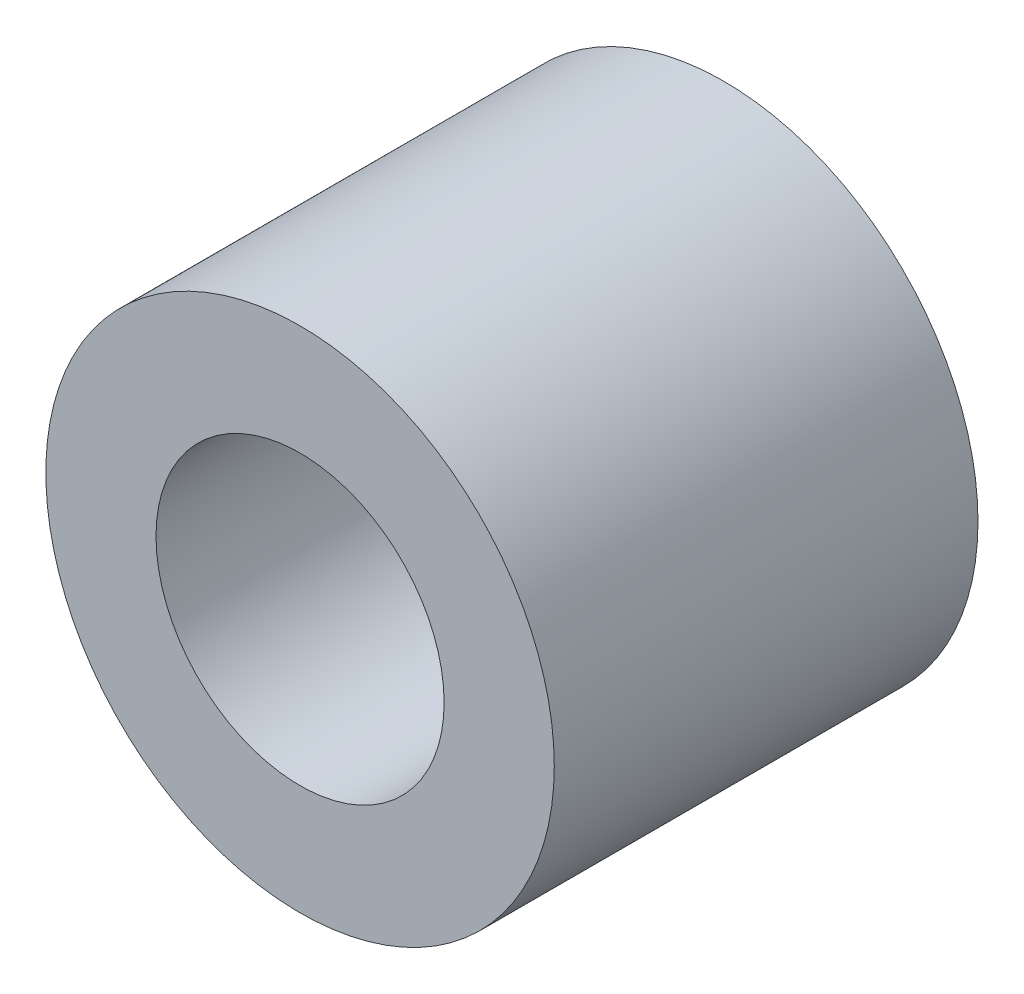
ISO-10303-21;
HEADER;
FILE_DESCRIPTION(('STEP AP214'),'2;1');
FILE_NAME('part.step','',(''),(''),'','','');
FILE_SCHEMA(('AUTOMOTIVE_DESIGN { 1 0 10303 214 1 1 1 1 }'));
ENDSEC;
DATA;
#1=APPLICATION_CONTEXT('core data for automotive mechanical design processes');
#2=APPLICATION_PROTOCOL_DEFINITION('international standard','automotive_design',2000,#1);
#3=PRODUCT_CONTEXT('',#1,'mechanical');
#4=PRODUCT('Part','Part','',(#3));
#5=PRODUCT_RELATED_PRODUCT_CATEGORY('part','',(#4));
#6=PRODUCT_DEFINITION_FORMATION('','',#4);
#7=PRODUCT_DEFINITION_CONTEXT('part definition',#1,'design');
#8=PRODUCT_DEFINITION('design','',#6,#7);
#9=PRODUCT_DEFINITION_SHAPE('','',#8);
#10=(LENGTH_UNIT() NAMED_UNIT(*) SI_UNIT(.MILLI.,.METRE.));
#11=(NAMED_UNIT(*) PLANE_ANGLE_UNIT() SI_UNIT($,.RADIAN.));
#12=(NAMED_UNIT(*) SI_UNIT($,.STERADIAN.) SOLID_ANGLE_UNIT());
#13=UNCERTAINTY_MEASURE_WITH_UNIT(LENGTH_MEASURE(1.E-05),#10,'distance_accuracy_value','');
#14=(GEOMETRIC_REPRESENTATION_CONTEXT(3) GLOBAL_UNCERTAINTY_ASSIGNED_CONTEXT((#13)) GLOBAL_UNIT_ASSIGNED_CONTEXT((#10,
#11,#12)) REPRESENTATION_CONTEXT('',''));
#15=CARTESIAN_POINT('',(0.,0.,0.));
#16=DIRECTION('',(0.,0.,1.));
#17=DIRECTION('',(1.,0.,0.));
#18=AXIS2_PLACEMENT_3D('',#15,#16,#17);
#19=CARTESIAN_POINT('',(0.,0.,-5.));
#20=DIRECTION('',(0.,0.,1.));
#21=DIRECTION('',(1.,0.,0.));
#22=AXIS2_PLACEMENT_3D('',#19,#20,#21);
#23=CYLINDRICAL_SURFACE('',#22,3.);
#24=CARTESIAN_POINT('',(0.,0.,-5.));
#25=DIRECTION('',(0.,0.,1.));
#26=DIRECTION('',(1.,0.,0.));
#27=AXIS2_PLACEMENT_3D('',#24,#25,#26);
#28=CIRCLE('',#27,3.);
#29=CARTESIAN_POINT('',(3.,0.,-5.));
#30=VERTEX_POINT('',#29);
#31=EDGE_CURVE('E10',#30,#30,#28,.T.);
#32=ORIENTED_EDGE('',*,*,#31,.T.);
#33=EDGE_LOOP('',(#32));
#34=FACE_BOUND('',#33,.T.);
#35=CARTESIAN_POINT('',(0.,0.,0.));
#36=DIRECTION('',(0.,0.,1.));
#37=DIRECTION('',(1.,0.,0.));
#38=AXIS2_PLACEMENT_3D('',#35,#36,#37);
#39=CIRCLE('',#38,3.);
#40=CARTESIAN_POINT('',(3.,0.,0.));
#41=VERTEX_POINT('',#40);
#42=EDGE_CURVE('E37',#41,#41,#39,.T.);
#43=ORIENTED_EDGE('',*,*,#42,.F.);
#44=EDGE_LOOP('',(#43));
#45=FACE_BOUND('',#44,.T.);
#46=ADVANCED_FACE('F40',(#34,#45),#23,.T.);
#47=CARTESIAN_POINT('',(0.,0.,-5.));
#48=DIRECTION('',(0.,0.,1.));
#49=DIRECTION('',(1.,0.,0.));
#50=AXIS2_PLACEMENT_3D('',#47,#48,#49);
#51=PLANE('',#50);
#52=CARTESIAN_POINT('',(0.,0.,-5.));
#53=DIRECTION('',(0.,0.,1.));
#54=DIRECTION('',(1.,0.,0.));
#55=AXIS2_PLACEMENT_3D('',#52,#53,#54);
#56=CIRCLE('',#55,1.7);
#57=CARTESIAN_POINT('',(1.7,0.,-5.));
#58=VERTEX_POINT('',#57);
#59=EDGE_CURVE('E50',#58,#58,#56,.T.);
#60=ORIENTED_EDGE('',*,*,#59,.T.);
#61=EDGE_LOOP('',(#60));
#62=FACE_BOUND('',#61,.T.);
#63=ORIENTED_EDGE('',*,*,#31,.F.);
#64=EDGE_LOOP('',(#63));
#65=FACE_BOUND('',#64,.T.);
#66=ADVANCED_FACE('F54',(#62,#65),#51,.F.);
#67=CARTESIAN_POINT('',(0.,0.,0.));
#68=DIRECTION('',(0.,0.,1.));
#69=DIRECTION('',(1.,0.,0.));
#70=AXIS2_PLACEMENT_3D('',#67,#68,#69);
#71=PLANE('',#70);
#72=CARTESIAN_POINT('',(0.,0.,0.));
#73=DIRECTION('',(0.,0.,1.));
#74=DIRECTION('',(1.,0.,0.));
#75=AXIS2_PLACEMENT_3D('',#72,#73,#74);
#76=CIRCLE('',#75,1.7);
#77=CARTESIAN_POINT('',(1.7,0.,0.));
#78=VERTEX_POINT('',#77);
#79=EDGE_CURVE('E47',#78,#78,#76,.T.);
#80=ORIENTED_EDGE('',*,*,#79,.F.);
#81=EDGE_LOOP('',(#80));
#82=FACE_BOUND('',#81,.T.);
#83=ORIENTED_EDGE('',*,*,#42,.T.);
#84=EDGE_LOOP('',(#83));
#85=FACE_BOUND('',#84,.T.);
#86=ADVANCED_FACE('F62',(#82,#85),#71,.T.);
#87=CARTESIAN_POINT('',(0.,0.,-5.));
#88=DIRECTION('',(0.,0.,1.));
#89=DIRECTION('',(1.,0.,0.));
#90=AXIS2_PLACEMENT_3D('',#87,#88,#89);
#91=CYLINDRICAL_SURFACE('',#90,1.7);
#92=ORIENTED_EDGE('',*,*,#59,.F.);
#93=EDGE_LOOP('',(#92));
#94=FACE_BOUND('',#93,.T.);
#95=ORIENTED_EDGE('',*,*,#79,.T.);
#96=EDGE_LOOP('',(#95));
#97=FACE_BOUND('',#96,.T.);
#98=ADVANCED_FACE('F59',(#94,#97),#91,.F.);
#99=CLOSED_SHELL('',(#46,#66,#86,#98));
#100=MANIFOLD_SOLID_BREP('B2',#99);
#101=ADVANCED_BREP_SHAPE_REPRESENTATION('',(#18,#100),#14);
#102=SHAPE_DEFINITION_REPRESENTATION(#9,#101);
ENDSEC;
END-ISO-10303-21;
